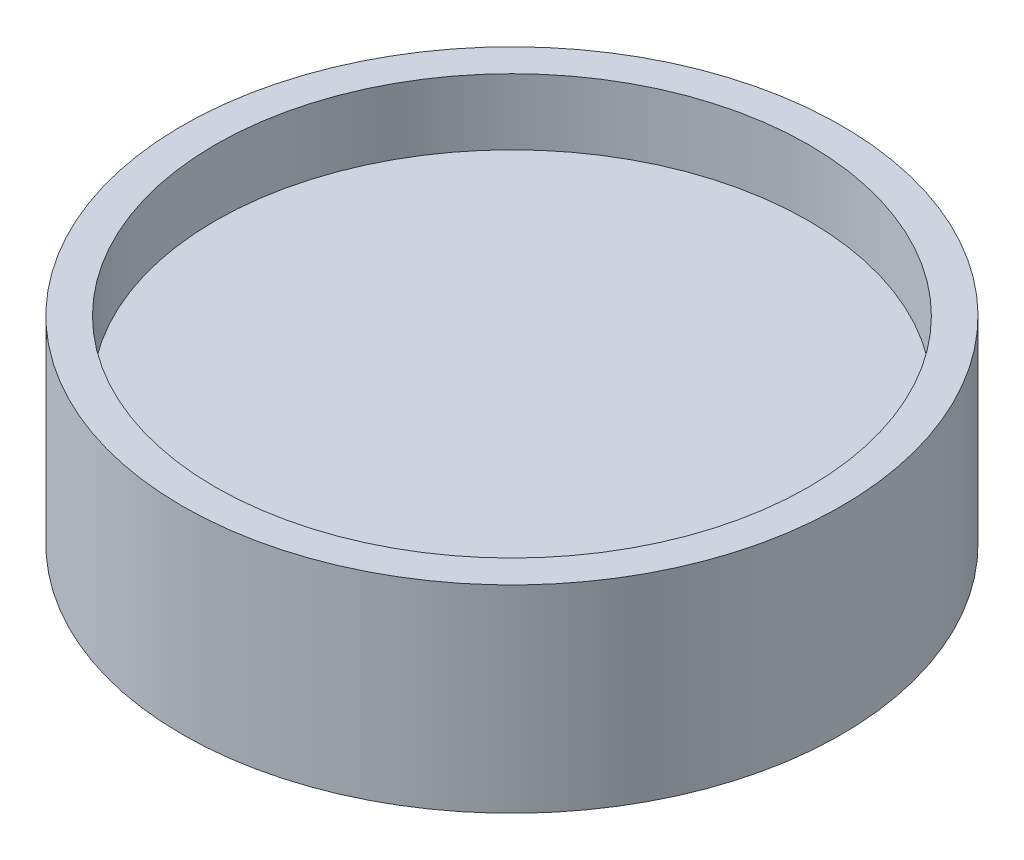
ISO-10303-21;
HEADER;
FILE_DESCRIPTION(('STEP AP214'),'2;1');
FILE_NAME('part.step','',(''),(''),'','','');
FILE_SCHEMA(('AUTOMOTIVE_DESIGN { 1 0 10303 214 1 1 1 1 }'));
ENDSEC;
DATA;
#1=APPLICATION_CONTEXT('core data for automotive mechanical design processes');
#2=APPLICATION_PROTOCOL_DEFINITION('international standard','automotive_design',2000,#1);
#3=PRODUCT_CONTEXT('',#1,'mechanical');
#4=PRODUCT('Part','Part','',(#3));
#5=PRODUCT_RELATED_PRODUCT_CATEGORY('part','',(#4));
#6=PRODUCT_DEFINITION_FORMATION('','',#4);
#7=PRODUCT_DEFINITION_CONTEXT('part definition',#1,'design');
#8=PRODUCT_DEFINITION('design','',#6,#7);
#9=PRODUCT_DEFINITION_SHAPE('','',#8);
#10=(LENGTH_UNIT() NAMED_UNIT(*) SI_UNIT(.MILLI.,.METRE.));
#11=(NAMED_UNIT(*) PLANE_ANGLE_UNIT() SI_UNIT($,.RADIAN.));
#12=(NAMED_UNIT(*) SI_UNIT($,.STERADIAN.) SOLID_ANGLE_UNIT());
#13=UNCERTAINTY_MEASURE_WITH_UNIT(LENGTH_MEASURE(1.E-05),#10,'distance_accuracy_value','');
#14=(GEOMETRIC_REPRESENTATION_CONTEXT(3) GLOBAL_UNCERTAINTY_ASSIGNED_CONTEXT((#13)) GLOBAL_UNIT_ASSIGNED_CONTEXT((#10,
#11,#12)) REPRESENTATION_CONTEXT('',''));
#15=CARTESIAN_POINT('',(0.,0.,0.));
#16=DIRECTION('',(0.,0.,1.));
#17=DIRECTION('',(1.,0.,0.));
#18=AXIS2_PLACEMENT_3D('',#15,#16,#17);
#19=CARTESIAN_POINT('',(0.,30.,0.));
#20=DIRECTION('',(0.,-1.,0.));
#21=DIRECTION('',(0.,0.,-1.));
#22=AXIS2_PLACEMENT_3D('',#19,#20,#21);
#23=CYLINDRICAL_SURFACE('',#22,50.);
#24=CARTESIAN_POINT('',(0.,30.,0.));
#25=DIRECTION('',(0.,1.,0.));
#26=DIRECTION('',(0.,0.,1.));
#27=AXIS2_PLACEMENT_3D('',#24,#25,#26);
#28=CIRCLE('',#27,50.);
#29=CARTESIAN_POINT('',(0.,30.,50.));
#30=VERTEX_POINT('',#29);
#31=EDGE_CURVE('E10',#30,#30,#28,.T.);
#32=ORIENTED_EDGE('',*,*,#31,.F.);
#33=EDGE_LOOP('',(#32));
#34=FACE_BOUND('',#33,.T.);
#35=CARTESIAN_POINT('',(0.,0.,0.));
#36=DIRECTION('',(0.,1.,0.));
#37=DIRECTION('',(0.,0.,1.));
#38=AXIS2_PLACEMENT_3D('',#35,#36,#37);
#39=CIRCLE('',#38,50.);
#40=CARTESIAN_POINT('',(0.,0.,50.));
#41=VERTEX_POINT('',#40);
#42=EDGE_CURVE('E35',#41,#41,#39,.T.);
#43=ORIENTED_EDGE('',*,*,#42,.T.);
#44=EDGE_LOOP('',(#43));
#45=FACE_BOUND('',#44,.T.);
#46=ADVANCED_FACE('F32',(#34,#45),#23,.T.);
#47=CARTESIAN_POINT('',(0.,30.,0.));
#48=DIRECTION('',(0.,1.,0.));
#49=DIRECTION('',(0.,0.,1.));
#50=AXIS2_PLACEMENT_3D('',#47,#48,#49);
#51=PLANE('',#50);
#52=CARTESIAN_POINT('',(0.,30.,0.));
#53=DIRECTION('',(0.,1.,0.));
#54=DIRECTION('',(0.,0.,1.));
#55=AXIS2_PLACEMENT_3D('',#52,#53,#54);
#56=CIRCLE('',#55,45.);
#57=CARTESIAN_POINT('',(0.,30.,45.));
#58=VERTEX_POINT('',#57);
#59=EDGE_CURVE('E44',#58,#58,#56,.T.);
#60=ORIENTED_EDGE('',*,*,#59,.F.);
#61=EDGE_LOOP('',(#60));
#62=FACE_BOUND('',#61,.T.);
#63=ORIENTED_EDGE('',*,*,#31,.T.);
#64=EDGE_LOOP('',(#63));
#65=FACE_BOUND('',#64,.T.);
#66=ADVANCED_FACE('F69',(#62,#65),#51,.T.);
#67=CARTESIAN_POINT('',(0.,0.,0.));
#68=DIRECTION('',(0.,1.,0.));
#69=DIRECTION('',(0.,0.,1.));
#70=AXIS2_PLACEMENT_3D('',#67,#68,#69);
#71=PLANE('',#70);
#72=CARTESIAN_POINT('',(0.,0.,0.));
#73=DIRECTION('',(0.,-1.,0.));
#74=DIRECTION('',(0.,0.,-1.));
#75=AXIS2_PLACEMENT_3D('',#72,#73,#74);
#76=CIRCLE('',#75,45.);
#77=CARTESIAN_POINT('',(0.,0.,-45.));
#78=VERTEX_POINT('',#77);
#79=EDGE_CURVE('E50',#78,#78,#76,.T.);
#80=ORIENTED_EDGE('',*,*,#79,.F.);
#81=EDGE_LOOP('',(#80));
#82=FACE_BOUND('',#81,.T.);
#83=ORIENTED_EDGE('',*,*,#42,.F.);
#84=EDGE_LOOP('',(#83));
#85=FACE_BOUND('',#84,.T.);
#86=ADVANCED_FACE('F65',(#82,#85),#71,.F.);
#87=CARTESIAN_POINT('',(0.,20.,0.));
#88=DIRECTION('',(0.,1.,0.));
#89=DIRECTION('',(0.,0.,1.));
#90=AXIS2_PLACEMENT_3D('',#87,#88,#89);
#91=CYLINDRICAL_SURFACE('',#90,45.);
#92=CARTESIAN_POINT('',(0.,20.,0.));
#93=DIRECTION('',(0.,1.,0.));
#94=DIRECTION('',(0.,0.,1.));
#95=AXIS2_PLACEMENT_3D('',#92,#93,#94);
#96=CIRCLE('',#95,45.);
#97=CARTESIAN_POINT('',(0.,20.,45.));
#98=VERTEX_POINT('',#97);
#99=EDGE_CURVE('E42',#98,#98,#96,.T.);
#100=ORIENTED_EDGE('',*,*,#99,.F.);
#101=EDGE_LOOP('',(#100));
#102=FACE_BOUND('',#101,.T.);
#103=ORIENTED_EDGE('',*,*,#59,.T.);
#104=EDGE_LOOP('',(#103));
#105=FACE_BOUND('',#104,.T.);
#106=ADVANCED_FACE('F68',(#102,#105),#91,.F.);
#107=CARTESIAN_POINT('',(0.,20.,0.));
#108=DIRECTION('',(0.,1.,0.));
#109=DIRECTION('',(0.,0.,1.));
#110=AXIS2_PLACEMENT_3D('',#107,#108,#109);
#111=PLANE('',#110);
#112=ORIENTED_EDGE('',*,*,#99,.T.);
#113=EDGE_LOOP('',(#112));
#114=FACE_BOUND('',#113,.T.);
#115=ADVANCED_FACE('F61',(#114),#111,.T.);
#116=CARTESIAN_POINT('',(0.,19.,0.));
#117=DIRECTION('',(0.,-1.,0.));
#118=DIRECTION('',(0.,0.,-1.));
#119=AXIS2_PLACEMENT_3D('',#116,#117,#118);
#120=CYLINDRICAL_SURFACE('',#119,45.);
#121=CARTESIAN_POINT('',(0.,19.,0.));
#122=DIRECTION('',(0.,-1.,0.));
#123=DIRECTION('',(0.,0.,-1.));
#124=AXIS2_PLACEMENT_3D('',#121,#122,#123);
#125=CIRCLE('',#124,45.);
#126=CARTESIAN_POINT('',(0.,19.,-45.));
#127=VERTEX_POINT('',#126);
#128=EDGE_CURVE('E47',#127,#127,#125,.T.);
#129=ORIENTED_EDGE('',*,*,#128,.F.);
#130=EDGE_LOOP('',(#129));
#131=FACE_BOUND('',#130,.T.);
#132=ORIENTED_EDGE('',*,*,#79,.T.);
#133=EDGE_LOOP('',(#132));
#134=FACE_BOUND('',#133,.T.);
#135=ADVANCED_FACE('F58',(#131,#134),#120,.F.);
#136=CARTESIAN_POINT('',(0.,19.,0.));
#137=DIRECTION('',(0.,-1.,0.));
#138=DIRECTION('',(0.,0.,-1.));
#139=AXIS2_PLACEMENT_3D('',#136,#137,#138);
#140=PLANE('',#139);
#141=ORIENTED_EDGE('',*,*,#128,.T.);
#142=EDGE_LOOP('',(#141));
#143=FACE_BOUND('',#142,.T.);
#144=ADVANCED_FACE('F56',(#143),#140,.T.);
#145=CLOSED_SHELL('',(#46,#66,#86,#106,#115,#135,#144));
#146=MANIFOLD_SOLID_BREP('B2',#145);
#147=ADVANCED_BREP_SHAPE_REPRESENTATION('',(#18,#146),#14);
#148=SHAPE_DEFINITION_REPRESENTATION(#9,#147);
ENDSEC;
END-ISO-10303-21;
